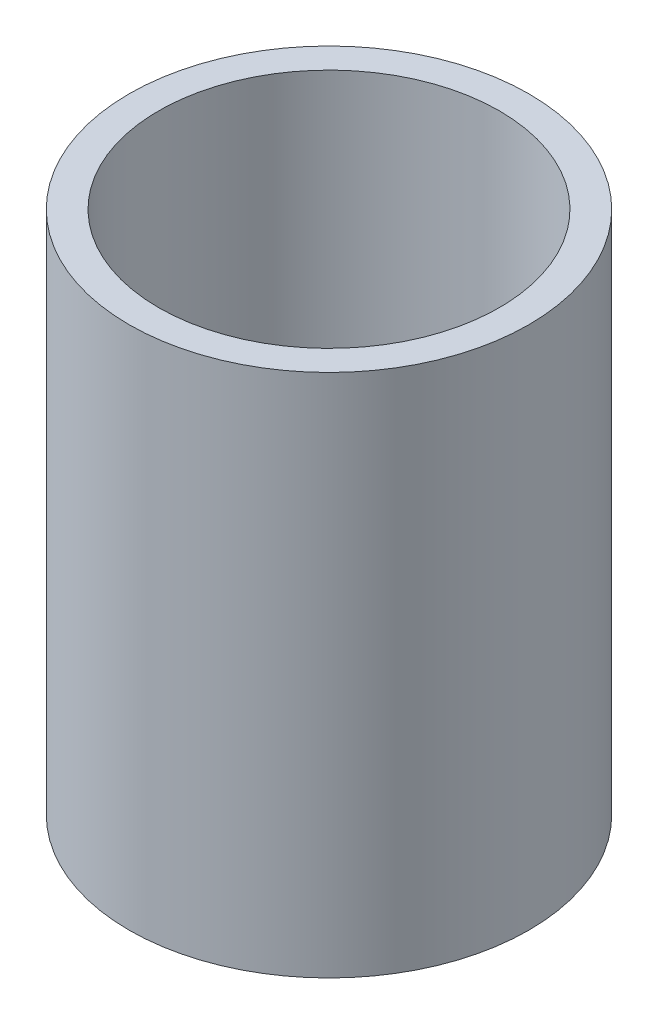
ISO-10303-21;
HEADER;
FILE_DESCRIPTION(('STEP AP214'),'2;1');
FILE_NAME('part.step','',(''),(''),'','','');
FILE_SCHEMA(('AUTOMOTIVE_DESIGN { 1 0 10303 214 1 1 1 1 }'));
ENDSEC;
DATA;
#1=APPLICATION_CONTEXT('core data for automotive mechanical design processes');
#2=APPLICATION_PROTOCOL_DEFINITION('international standard','automotive_design',2000,#1);
#3=PRODUCT_CONTEXT('',#1,'mechanical');
#4=PRODUCT('Part','Part','',(#3));
#5=PRODUCT_RELATED_PRODUCT_CATEGORY('part','',(#4));
#6=PRODUCT_DEFINITION_FORMATION('','',#4);
#7=PRODUCT_DEFINITION_CONTEXT('part definition',#1,'design');
#8=PRODUCT_DEFINITION('design','',#6,#7);
#9=PRODUCT_DEFINITION_SHAPE('','',#8);
#10=(LENGTH_UNIT() NAMED_UNIT(*) SI_UNIT(.MILLI.,.METRE.));
#11=(NAMED_UNIT(*) PLANE_ANGLE_UNIT() SI_UNIT($,.RADIAN.));
#12=(NAMED_UNIT(*) SI_UNIT($,.STERADIAN.) SOLID_ANGLE_UNIT());
#13=UNCERTAINTY_MEASURE_WITH_UNIT(LENGTH_MEASURE(1.E-05),#10,'distance_accuracy_value','');
#14=(GEOMETRIC_REPRESENTATION_CONTEXT(3) GLOBAL_UNCERTAINTY_ASSIGNED_CONTEXT((#13)) GLOBAL_UNIT_ASSIGNED_CONTEXT((#10,
#11,#12)) REPRESENTATION_CONTEXT('',''));
#15=CARTESIAN_POINT('',(0.,0.,0.));
#16=DIRECTION('',(0.,0.,1.));
#17=DIRECTION('',(1.,0.,0.));
#18=AXIS2_PLACEMENT_3D('',#15,#16,#17);
#19=CARTESIAN_POINT('',(0.,40.,0.));
#20=DIRECTION('',(0.,1.,0.));
#21=DIRECTION('',(0.,0.,1.));
#22=AXIS2_PLACEMENT_3D('',#19,#20,#21);
#23=PLANE('',#22);
#24=CARTESIAN_POINT('',(0.,40.,0.));
#25=DIRECTION('',(0.,1.,0.));
#26=DIRECTION('',(0.,0.,1.));
#27=AXIS2_PLACEMENT_3D('',#24,#25,#26);
#28=CIRCLE('',#27,15.25);
#29=CARTESIAN_POINT('',(0.,40.,15.25));
#30=VERTEX_POINT('',#29);
#31=EDGE_CURVE('E10',#30,#30,#28,.T.);
#32=ORIENTED_EDGE('',*,*,#31,.T.);
#33=EDGE_LOOP('',(#32));
#34=FACE_BOUND('',#33,.T.);
#35=CARTESIAN_POINT('',(0.,40.,0.));
#36=DIRECTION('',(0.,1.,0.));
#37=DIRECTION('',(0.,0.,1.));
#38=AXIS2_PLACEMENT_3D('',#35,#36,#37);
#39=CIRCLE('',#38,13.);
#40=CARTESIAN_POINT('',(0.,40.,13.));
#41=VERTEX_POINT('',#40);
#42=EDGE_CURVE('E50',#41,#41,#39,.T.);
#43=ORIENTED_EDGE('',*,*,#42,.F.);
#44=EDGE_LOOP('',(#43));
#45=FACE_BOUND('',#44,.T.);
#46=ADVANCED_FACE('F37',(#34,#45),#23,.T.);
#47=CARTESIAN_POINT('',(0.,0.,0.));
#48=DIRECTION('',(0.,1.,0.));
#49=DIRECTION('',(0.,0.,1.));
#50=AXIS2_PLACEMENT_3D('',#47,#48,#49);
#51=PLANE('',#50);
#52=CARTESIAN_POINT('',(0.,0.,0.));
#53=DIRECTION('',(0.,1.,0.));
#54=DIRECTION('',(0.,0.,1.));
#55=AXIS2_PLACEMENT_3D('',#52,#53,#54);
#56=CIRCLE('',#55,15.25);
#57=CARTESIAN_POINT('',(0.,0.,15.25));
#58=VERTEX_POINT('',#57);
#59=EDGE_CURVE('E41',#58,#58,#56,.T.);
#60=ORIENTED_EDGE('',*,*,#59,.F.);
#61=EDGE_LOOP('',(#60));
#62=FACE_BOUND('',#61,.T.);
#63=CARTESIAN_POINT('',(0.,0.,0.));
#64=DIRECTION('',(0.,1.,0.));
#65=DIRECTION('',(0.,0.,1.));
#66=AXIS2_PLACEMENT_3D('',#63,#64,#65);
#67=CIRCLE('',#66,13.);
#68=CARTESIAN_POINT('',(0.,0.,13.));
#69=VERTEX_POINT('',#68);
#70=EDGE_CURVE('E52',#69,#69,#67,.T.);
#71=ORIENTED_EDGE('',*,*,#70,.T.);
#72=EDGE_LOOP('',(#71));
#73=FACE_BOUND('',#72,.T.);
#74=ADVANCED_FACE('F64',(#62,#73),#51,.F.);
#75=CARTESIAN_POINT('',(0.,40.,0.));
#76=DIRECTION('',(0.,-1.,0.));
#77=DIRECTION('',(0.,0.,-1.));
#78=AXIS2_PLACEMENT_3D('',#75,#76,#77);
#79=CYLINDRICAL_SURFACE('',#78,15.25);
#80=ORIENTED_EDGE('',*,*,#31,.F.);
#81=EDGE_LOOP('',(#80));
#82=FACE_BOUND('',#81,.T.);
#83=ORIENTED_EDGE('',*,*,#59,.T.);
#84=EDGE_LOOP('',(#83));
#85=FACE_BOUND('',#84,.T.);
#86=ADVANCED_FACE('F39',(#82,#85),#79,.T.);
#87=CARTESIAN_POINT('',(0.,40.,0.));
#88=DIRECTION('',(0.,-1.,0.));
#89=DIRECTION('',(0.,0.,-1.));
#90=AXIS2_PLACEMENT_3D('',#87,#88,#89);
#91=CYLINDRICAL_SURFACE('',#90,13.);
#92=ORIENTED_EDGE('',*,*,#42,.T.);
#93=EDGE_LOOP('',(#92));
#94=FACE_BOUND('',#93,.T.);
#95=ORIENTED_EDGE('',*,*,#70,.F.);
#96=EDGE_LOOP('',(#95));
#97=FACE_BOUND('',#96,.T.);
#98=ADVANCED_FACE('F60',(#94,#97),#91,.F.);
#99=CLOSED_SHELL('',(#46,#74,#86,#98));
#100=MANIFOLD_SOLID_BREP('B2',#99);
#101=ADVANCED_BREP_SHAPE_REPRESENTATION('',(#18,#100),#14);
#102=SHAPE_DEFINITION_REPRESENTATION(#9,#101);
ENDSEC;
END-ISO-10303-21;
